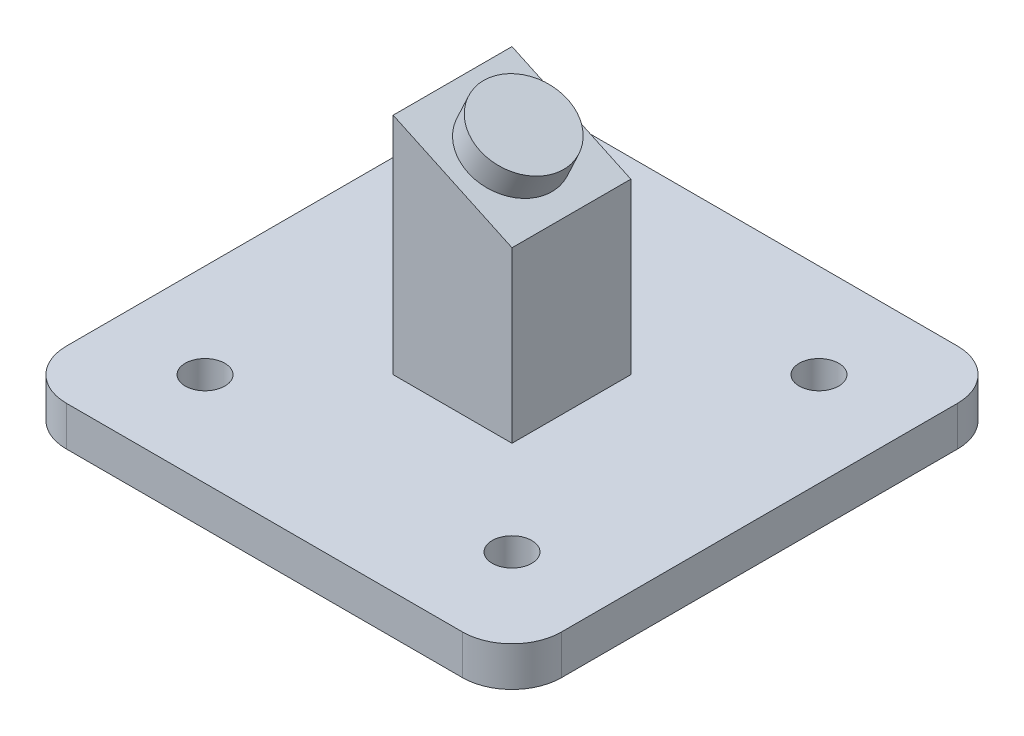
ISO-10303-21;
HEADER;
FILE_DESCRIPTION(('STEP AP214'),'2;1');
FILE_NAME('part.step','',(''),(''),'','','');
FILE_SCHEMA(('AUTOMOTIVE_DESIGN { 1 0 10303 214 1 1 1 1 }'));
ENDSEC;
DATA;
#1=APPLICATION_CONTEXT('core data for automotive mechanical design processes');
#2=APPLICATION_PROTOCOL_DEFINITION('international standard','automotive_design',2000,#1);
#3=PRODUCT_CONTEXT('',#1,'mechanical');
#4=PRODUCT('Part','Part','',(#3));
#5=PRODUCT_RELATED_PRODUCT_CATEGORY('part','',(#4));
#6=PRODUCT_DEFINITION_FORMATION('','',#4);
#7=PRODUCT_DEFINITION_CONTEXT('part definition',#1,'design');
#8=PRODUCT_DEFINITION('design','',#6,#7);
#9=PRODUCT_DEFINITION_SHAPE('','',#8);
#10=(LENGTH_UNIT() NAMED_UNIT(*) SI_UNIT(.MILLI.,.METRE.));
#11=(NAMED_UNIT(*) PLANE_ANGLE_UNIT() SI_UNIT($,.RADIAN.));
#12=(NAMED_UNIT(*) SI_UNIT($,.STERADIAN.) SOLID_ANGLE_UNIT());
#13=UNCERTAINTY_MEASURE_WITH_UNIT(LENGTH_MEASURE(1.E-05),#10,'distance_accuracy_value','');
#14=(GEOMETRIC_REPRESENTATION_CONTEXT(3) GLOBAL_UNCERTAINTY_ASSIGNED_CONTEXT((#13)) GLOBAL_UNIT_ASSIGNED_CONTEXT((#10,
#11,#12)) REPRESENTATION_CONTEXT('',''));
#15=CARTESIAN_POINT('',(0.,0.,0.));
#16=DIRECTION('',(0.,0.,1.));
#17=DIRECTION('',(1.,0.,0.));
#18=AXIS2_PLACEMENT_3D('',#15,#16,#17);
#19=CARTESIAN_POINT('',(45.,4.,-45.));
#20=DIRECTION('',(0.,-1.,0.));
#21=DIRECTION('',(0.,0.,-1.));
#22=AXIS2_PLACEMENT_3D('',#19,#20,#21);
#23=PLANE('',#22);
#24=CARTESIAN_POINT('',(40.5,4.,-9.5));
#25=DIRECTION('',(0.,1.,0.));
#26=DIRECTION('',(0.,0.,1.));
#27=AXIS2_PLACEMENT_3D('',#24,#25,#26);
#28=CIRCLE('',#27,2.);
#29=CARTESIAN_POINT('',(40.5,4.,-7.5));
#30=VERTEX_POINT('',#29);
#31=EDGE_CURVE('E195',#30,#30,#28,.T.);
#32=ORIENTED_EDGE('',*,*,#31,.F.);
#33=EDGE_LOOP('',(#32));
#34=FACE_BOUND('',#33,.T.);
#35=CARTESIAN_POINT('',(40.5,4.,-40.5));
#36=DIRECTION('',(0.,1.,0.));
#37=DIRECTION('',(0.,0.,1.));
#38=AXIS2_PLACEMENT_3D('',#35,#36,#37);
#39=CIRCLE('',#38,2.);
#40=CARTESIAN_POINT('',(40.5,4.,-38.5));
#41=VERTEX_POINT('',#40);
#42=EDGE_CURVE('E203',#41,#41,#39,.T.);
#43=ORIENTED_EDGE('',*,*,#42,.F.);
#44=EDGE_LOOP('',(#43));
#45=FACE_BOUND('',#44,.T.);
#46=CARTESIAN_POINT('',(9.50000000000001,4.,-40.5));
#47=DIRECTION('',(0.,1.,0.));
#48=DIRECTION('',(0.,0.,1.));
#49=AXIS2_PLACEMENT_3D('',#46,#47,#48);
#50=CIRCLE('',#49,2.);
#51=CARTESIAN_POINT('',(9.50000000000001,4.,-38.5));
#52=VERTEX_POINT('',#51);
#53=EDGE_CURVE('E211',#52,#52,#50,.T.);
#54=ORIENTED_EDGE('',*,*,#53,.F.);
#55=EDGE_LOOP('',(#54));
#56=FACE_BOUND('',#55,.T.);
#57=CARTESIAN_POINT('',(9.50000000000001,4.,-9.5));
#58=DIRECTION('',(0.,1.,0.));
#59=DIRECTION('',(0.,0.,1.));
#60=AXIS2_PLACEMENT_3D('',#57,#58,#59);
#61=CIRCLE('',#60,2.);
#62=CARTESIAN_POINT('',(9.50000000000001,4.,-7.5));
#63=VERTEX_POINT('',#62);
#64=EDGE_CURVE('E219',#63,#63,#61,.T.);
#65=ORIENTED_EDGE('',*,*,#64,.F.);
#66=EDGE_LOOP('',(#65));
#67=FACE_BOUND('',#66,.T.);
#68=CARTESIAN_POINT('',(45.,4.,-45.));
#69=DIRECTION('',(0.,1.,0.));
#70=DIRECTION('',(0.,0.,-1.));
#71=AXIS2_PLACEMENT_3D('',#68,#69,#70);
#72=CIRCLE('',#71,5.);
#73=CARTESIAN_POINT('',(50.,4.,-45.));
#74=VERTEX_POINT('',#73);
#75=CARTESIAN_POINT('',(45.,4.,-50.));
#76=VERTEX_POINT('',#75);
#77=EDGE_CURVE('E227',#74,#76,#72,.T.);
#78=ORIENTED_EDGE('',*,*,#77,.T.);
#79=DIRECTION('',(-1.,0.,0.));
#80=VECTOR('',#79,1.);
#81=CARTESIAN_POINT('',(5.00000000000004,4.,-50.));
#82=LINE('',#81,#80);
#83=CARTESIAN_POINT('',(5.00000000000004,4.,-50.));
#84=VERTEX_POINT('',#83);
#85=EDGE_CURVE('E231',#76,#84,#82,.T.);
#86=ORIENTED_EDGE('',*,*,#85,.T.);
#87=CARTESIAN_POINT('',(5.,4.,-45.));
#88=DIRECTION('',(0.,1.,0.));
#89=DIRECTION('',(0.,0.,-1.));
#90=AXIS2_PLACEMENT_3D('',#87,#88,#89);
#91=CIRCLE('',#90,5.);
#92=CARTESIAN_POINT('',(0.,4.,-45.));
#93=VERTEX_POINT('',#92);
#94=EDGE_CURVE('E235',#84,#93,#91,.T.);
#95=ORIENTED_EDGE('',*,*,#94,.T.);
#96=DIRECTION('',(0.,0.,1.));
#97=VECTOR('',#96,1.);
#98=CARTESIAN_POINT('',(0.,4.,-5.00000000000004));
#99=LINE('',#98,#97);
#100=CARTESIAN_POINT('',(0.,4.,-5.00000000000004));
#101=VERTEX_POINT('',#100);
#102=EDGE_CURVE('E238',#93,#101,#99,.T.);
#103=ORIENTED_EDGE('',*,*,#102,.T.);
#104=CARTESIAN_POINT('',(5.,4.,-5.));
#105=DIRECTION('',(0.,1.,0.));
#106=DIRECTION('',(0.,0.,-1.));
#107=AXIS2_PLACEMENT_3D('',#104,#105,#106);
#108=CIRCLE('',#107,5.);
#109=CARTESIAN_POINT('',(5.00000000000004,4.,0.));
#110=VERTEX_POINT('',#109);
#111=EDGE_CURVE('E241',#101,#110,#108,.T.);
#112=ORIENTED_EDGE('',*,*,#111,.T.);
#113=DIRECTION('',(1.,0.,0.));
#114=VECTOR('',#113,1.);
#115=CARTESIAN_POINT('',(5.00000000000004,4.,0.));
#116=LINE('',#115,#114);
#117=CARTESIAN_POINT('',(45.,4.,0.));
#118=VERTEX_POINT('',#117);
#119=EDGE_CURVE('E243',#110,#118,#116,.T.);
#120=ORIENTED_EDGE('',*,*,#119,.T.);
#121=CARTESIAN_POINT('',(45.,4.,-5.));
#122=DIRECTION('',(0.,1.,0.));
#123=DIRECTION('',(0.,0.,1.));
#124=AXIS2_PLACEMENT_3D('',#121,#122,#123);
#125=CIRCLE('',#124,5.);
#126=CARTESIAN_POINT('',(50.,4.,-5.00000000000003));
#127=VERTEX_POINT('',#126);
#128=EDGE_CURVE('E246',#118,#127,#125,.T.);
#129=ORIENTED_EDGE('',*,*,#128,.T.);
#130=DIRECTION('',(0.,0.,-1.));
#131=VECTOR('',#130,1.);
#132=CARTESIAN_POINT('',(50.,4.,-5.00000000000004));
#133=LINE('',#132,#131);
#134=EDGE_CURVE('E249',#127,#74,#133,.T.);
#135=ORIENTED_EDGE('',*,*,#134,.T.);
#136=EDGE_LOOP('',(#78,#86,#95,#103,#112,#120,#129,#135));
#137=FACE_BOUND('',#136,.T.);
#138=DIRECTION('',(0.,0.,1.));
#139=VECTOR('',#138,1.);
#140=CARTESIAN_POINT('',(19.,4.,-31.));
#141=LINE('',#140,#139);
#142=CARTESIAN_POINT('',(19.,4.,-31.));
#143=VERTEX_POINT('',#142);
#144=CARTESIAN_POINT('',(19.,4.,-19.));
#145=VERTEX_POINT('',#144);
#146=EDGE_CURVE('E142',#143,#145,#141,.T.);
#147=ORIENTED_EDGE('',*,*,#146,.F.);
#148=DIRECTION('',(-1.,0.,0.));
#149=VECTOR('',#148,1.);
#150=CARTESIAN_POINT('',(19.,4.,-31.));
#151=LINE('',#150,#149);
#152=CARTESIAN_POINT('',(31.,4.,-31.));
#153=VERTEX_POINT('',#152);
#154=EDGE_CURVE('E177',#153,#143,#151,.T.);
#155=ORIENTED_EDGE('',*,*,#154,.F.);
#156=DIRECTION('',(0.,0.,-1.));
#157=VECTOR('',#156,1.);
#158=CARTESIAN_POINT('',(31.,4.,-31.));
#159=LINE('',#158,#157);
#160=CARTESIAN_POINT('',(31.,4.,-19.));
#161=VERTEX_POINT('',#160);
#162=EDGE_CURVE('E69',#161,#153,#159,.T.);
#163=ORIENTED_EDGE('',*,*,#162,.F.);
#164=DIRECTION('',(1.,0.,0.));
#165=VECTOR('',#164,1.);
#166=CARTESIAN_POINT('',(19.,4.,-19.));
#167=LINE('',#166,#165);
#168=EDGE_CURVE('E64',#145,#161,#167,.T.);
#169=ORIENTED_EDGE('',*,*,#168,.F.);
#170=EDGE_LOOP('',(#147,#155,#163,#169));
#171=FACE_BOUND('',#170,.T.);
#172=ADVANCED_FACE('F47',(#34,#45,#56,#67,#137,#171),#23,.F.);
#173=CARTESIAN_POINT('',(45.,0.,-45.));
#174=DIRECTION('',(0.,-1.,0.));
#175=DIRECTION('',(0.,0.,-1.));
#176=AXIS2_PLACEMENT_3D('',#173,#174,#175);
#177=PLANE('',#176);
#178=CARTESIAN_POINT('',(40.5,0.,-40.5));
#179=DIRECTION('',(0.,1.,0.));
#180=DIRECTION('',(0.,0.,1.));
#181=AXIS2_PLACEMENT_3D('',#178,#179,#180);
#182=CIRCLE('',#181,2.);
#183=CARTESIAN_POINT('',(40.5,0.,-38.5));
#184=VERTEX_POINT('',#183);
#185=EDGE_CURVE('E199',#184,#184,#182,.T.);
#186=ORIENTED_EDGE('',*,*,#185,.T.);
#187=EDGE_LOOP('',(#186));
#188=FACE_BOUND('',#187,.T.);
#189=CARTESIAN_POINT('',(9.50000000000001,0.,-9.5));
#190=DIRECTION('',(0.,1.,0.));
#191=DIRECTION('',(0.,0.,1.));
#192=AXIS2_PLACEMENT_3D('',#189,#190,#191);
#193=CIRCLE('',#192,2.);
#194=CARTESIAN_POINT('',(9.50000000000001,0.,-7.5));
#195=VERTEX_POINT('',#194);
#196=EDGE_CURVE('E215',#195,#195,#193,.T.);
#197=ORIENTED_EDGE('',*,*,#196,.T.);
#198=EDGE_LOOP('',(#197));
#199=FACE_BOUND('',#198,.T.);
#200=CARTESIAN_POINT('',(45.,0.,-45.));
#201=DIRECTION('',(0.,1.,0.));
#202=DIRECTION('',(0.,0.,-1.));
#203=AXIS2_PLACEMENT_3D('',#200,#201,#202);
#204=CIRCLE('',#203,5.);
#205=CARTESIAN_POINT('',(50.,0.,-45.));
#206=VERTEX_POINT('',#205);
#207=CARTESIAN_POINT('',(45.,0.,-50.));
#208=VERTEX_POINT('',#207);
#209=EDGE_CURVE('E223',#206,#208,#204,.T.);
#210=ORIENTED_EDGE('',*,*,#209,.F.);
#211=DIRECTION('',(0.,0.,-1.));
#212=VECTOR('',#211,1.);
#213=CARTESIAN_POINT('',(50.,0.,-5.00000000000004));
#214=LINE('',#213,#212);
#215=CARTESIAN_POINT('',(50.,0.,-5.00000000000003));
#216=VERTEX_POINT('',#215);
#217=EDGE_CURVE('E232',#216,#206,#214,.T.);
#218=ORIENTED_EDGE('',*,*,#217,.F.);
#219=CARTESIAN_POINT('',(45.,0.,-5.));
#220=DIRECTION('',(0.,1.,0.));
#221=DIRECTION('',(0.,0.,1.));
#222=AXIS2_PLACEMENT_3D('',#219,#220,#221);
#223=CIRCLE('',#222,5.);
#224=CARTESIAN_POINT('',(45.,0.,0.));
#225=VERTEX_POINT('',#224);
#226=EDGE_CURVE('E271',#225,#216,#223,.T.);
#227=ORIENTED_EDGE('',*,*,#226,.F.);
#228=DIRECTION('',(1.,0.,0.));
#229=VECTOR('',#228,1.);
#230=CARTESIAN_POINT('',(5.00000000000004,0.,0.));
#231=LINE('',#230,#229);
#232=CARTESIAN_POINT('',(5.00000000000004,0.,0.));
#233=VERTEX_POINT('',#232);
#234=EDGE_CURVE('E268',#233,#225,#231,.T.);
#235=ORIENTED_EDGE('',*,*,#234,.F.);
#236=CARTESIAN_POINT('',(5.,0.,-5.));
#237=DIRECTION('',(0.,1.,0.));
#238=DIRECTION('',(0.,0.,-1.));
#239=AXIS2_PLACEMENT_3D('',#236,#237,#238);
#240=CIRCLE('',#239,5.);
#241=CARTESIAN_POINT('',(0.,0.,-5.00000000000004));
#242=VERTEX_POINT('',#241);
#243=EDGE_CURVE('E265',#242,#233,#240,.T.);
#244=ORIENTED_EDGE('',*,*,#243,.F.);
#245=DIRECTION('',(0.,0.,1.));
#246=VECTOR('',#245,1.);
#247=CARTESIAN_POINT('',(0.,0.,-5.00000000000004));
#248=LINE('',#247,#246);
#249=CARTESIAN_POINT('',(0.,0.,-45.));
#250=VERTEX_POINT('',#249);
#251=EDGE_CURVE('E262',#250,#242,#248,.T.);
#252=ORIENTED_EDGE('',*,*,#251,.F.);
#253=CARTESIAN_POINT('',(5.,0.,-45.));
#254=DIRECTION('',(0.,1.,0.));
#255=DIRECTION('',(0.,0.,-1.));
#256=AXIS2_PLACEMENT_3D('',#253,#254,#255);
#257=CIRCLE('',#256,5.);
#258=CARTESIAN_POINT('',(5.00000000000004,0.,-50.));
#259=VERTEX_POINT('',#258);
#260=EDGE_CURVE('E259',#259,#250,#257,.T.);
#261=ORIENTED_EDGE('',*,*,#260,.F.);
#262=DIRECTION('',(-1.,0.,0.));
#263=VECTOR('',#262,1.);
#264=CARTESIAN_POINT('',(5.00000000000004,0.,-50.));
#265=LINE('',#264,#263);
#266=EDGE_CURVE('E256',#208,#259,#265,.T.);
#267=ORIENTED_EDGE('',*,*,#266,.F.);
#268=EDGE_LOOP('',(#210,#218,#227,#235,#244,#252,#261,#267));
#269=FACE_BOUND('',#268,.T.);
#270=CARTESIAN_POINT('',(9.50000000000001,0.,-40.5));
#271=DIRECTION('',(0.,1.,0.));
#272=DIRECTION('',(0.,0.,1.));
#273=AXIS2_PLACEMENT_3D('',#270,#271,#272);
#274=CIRCLE('',#273,2.);
#275=CARTESIAN_POINT('',(9.50000000000001,0.,-38.5));
#276=VERTEX_POINT('',#275);
#277=EDGE_CURVE('E207',#276,#276,#274,.T.);
#278=ORIENTED_EDGE('',*,*,#277,.T.);
#279=EDGE_LOOP('',(#278));
#280=FACE_BOUND('',#279,.T.);
#281=CARTESIAN_POINT('',(40.5,0.,-9.5));
#282=DIRECTION('',(0.,1.,0.));
#283=DIRECTION('',(0.,0.,1.));
#284=AXIS2_PLACEMENT_3D('',#281,#282,#283);
#285=CIRCLE('',#284,2.);
#286=CARTESIAN_POINT('',(40.5,0.,-7.5));
#287=VERTEX_POINT('',#286);
#288=EDGE_CURVE('E146',#287,#287,#285,.T.);
#289=ORIENTED_EDGE('',*,*,#288,.T.);
#290=EDGE_LOOP('',(#289));
#291=FACE_BOUND('',#290,.T.);
#292=ADVANCED_FACE('F317',(#188,#199,#269,#280,#291),#177,.T.);
#293=CARTESIAN_POINT('',(45.,4.,-45.));
#294=DIRECTION('',(0.,-1.,0.));
#295=DIRECTION('',(0.,0.,-1.));
#296=AXIS2_PLACEMENT_3D('',#293,#294,#295);
#297=CYLINDRICAL_SURFACE('',#296,5.);
#298=ORIENTED_EDGE('',*,*,#209,.T.);
#299=DIRECTION('',(0.,-1.,0.));
#300=VECTOR('',#299,1.);
#301=CARTESIAN_POINT('',(45.,4.,-50.));
#302=LINE('',#301,#300);
#303=EDGE_CURVE('E51',#76,#208,#302,.T.);
#304=ORIENTED_EDGE('',*,*,#303,.F.);
#305=ORIENTED_EDGE('',*,*,#77,.F.);
#306=DIRECTION('',(0.,-1.,0.));
#307=VECTOR('',#306,1.);
#308=CARTESIAN_POINT('',(50.,4.,-45.));
#309=LINE('',#308,#307);
#310=EDGE_CURVE('E252',#74,#206,#309,.T.);
#311=ORIENTED_EDGE('',*,*,#310,.T.);
#312=EDGE_LOOP('',(#298,#304,#305,#311));
#313=FACE_BOUND('',#312,.T.);
#314=ADVANCED_FACE('F49',(#313),#297,.T.);
#315=CARTESIAN_POINT('',(5.00000000000004,4.,-50.));
#316=DIRECTION('',(0.,0.,1.));
#317=DIRECTION('',(1.,0.,0.));
#318=AXIS2_PLACEMENT_3D('',#315,#316,#317);
#319=PLANE('',#318);
#320=ORIENTED_EDGE('',*,*,#266,.T.);
#321=DIRECTION('',(0.,-1.,0.));
#322=VECTOR('',#321,1.);
#323=CARTESIAN_POINT('',(5.00000000000004,4.,-50.));
#324=LINE('',#323,#322);
#325=EDGE_CURVE('E297',#84,#259,#324,.T.);
#326=ORIENTED_EDGE('',*,*,#325,.F.);
#327=ORIENTED_EDGE('',*,*,#85,.F.);
#328=ORIENTED_EDGE('',*,*,#303,.T.);
#329=EDGE_LOOP('',(#320,#326,#327,#328));
#330=FACE_BOUND('',#329,.T.);
#331=ADVANCED_FACE('F310',(#330),#319,.F.);
#332=CARTESIAN_POINT('',(5.,4.,-45.));
#333=DIRECTION('',(0.,-1.,0.));
#334=DIRECTION('',(0.,0.,-1.));
#335=AXIS2_PLACEMENT_3D('',#332,#333,#334);
#336=CYLINDRICAL_SURFACE('',#335,5.);
#337=ORIENTED_EDGE('',*,*,#260,.T.);
#338=DIRECTION('',(0.,-1.,0.));
#339=VECTOR('',#338,1.);
#340=CARTESIAN_POINT('',(0.,4.,-45.));
#341=LINE('',#340,#339);
#342=EDGE_CURVE('E295',#93,#250,#341,.T.);
#343=ORIENTED_EDGE('',*,*,#342,.F.);
#344=ORIENTED_EDGE('',*,*,#94,.F.);
#345=ORIENTED_EDGE('',*,*,#325,.T.);
#346=EDGE_LOOP('',(#337,#343,#344,#345));
#347=FACE_BOUND('',#346,.T.);
#348=ADVANCED_FACE('F323',(#347),#336,.T.);
#349=CARTESIAN_POINT('',(0.,4.,-5.00000000000004));
#350=DIRECTION('',(1.,0.,0.));
#351=DIRECTION('',(0.,0.,-1.));
#352=AXIS2_PLACEMENT_3D('',#349,#350,#351);
#353=PLANE('',#352);
#354=ORIENTED_EDGE('',*,*,#251,.T.);
#355=DIRECTION('',(0.,-1.,0.));
#356=VECTOR('',#355,1.);
#357=CARTESIAN_POINT('',(0.,4.,-5.00000000000004));
#358=LINE('',#357,#356);
#359=EDGE_CURVE('E291',#101,#242,#358,.T.);
#360=ORIENTED_EDGE('',*,*,#359,.F.);
#361=ORIENTED_EDGE('',*,*,#102,.F.);
#362=ORIENTED_EDGE('',*,*,#342,.T.);
#363=EDGE_LOOP('',(#354,#360,#361,#362));
#364=FACE_BOUND('',#363,.T.);
#365=ADVANCED_FACE('F326',(#364),#353,.F.);
#366=CARTESIAN_POINT('',(5.,4.,-5.));
#367=DIRECTION('',(0.,-1.,0.));
#368=DIRECTION('',(0.,0.,-1.));
#369=AXIS2_PLACEMENT_3D('',#366,#367,#368);
#370=CYLINDRICAL_SURFACE('',#369,5.);
#371=ORIENTED_EDGE('',*,*,#243,.T.);
#372=DIRECTION('',(0.,-1.,0.));
#373=VECTOR('',#372,1.);
#374=CARTESIAN_POINT('',(5.00000000000004,4.,0.));
#375=LINE('',#374,#373);
#376=EDGE_CURVE('E287',#110,#233,#375,.T.);
#377=ORIENTED_EDGE('',*,*,#376,.F.);
#378=ORIENTED_EDGE('',*,*,#111,.F.);
#379=ORIENTED_EDGE('',*,*,#359,.T.);
#380=EDGE_LOOP('',(#371,#377,#378,#379));
#381=FACE_BOUND('',#380,.T.);
#382=ADVANCED_FACE('F344',(#381),#370,.T.);
#383=CARTESIAN_POINT('',(5.00000000000004,4.,0.));
#384=DIRECTION('',(0.,0.,-1.));
#385=DIRECTION('',(-1.,0.,0.));
#386=AXIS2_PLACEMENT_3D('',#383,#384,#385);
#387=PLANE('',#386);
#388=ORIENTED_EDGE('',*,*,#234,.T.);
#389=DIRECTION('',(0.,-1.,0.));
#390=VECTOR('',#389,1.);
#391=CARTESIAN_POINT('',(45.,4.,0.));
#392=LINE('',#391,#390);
#393=EDGE_CURVE('E283',#118,#225,#392,.T.);
#394=ORIENTED_EDGE('',*,*,#393,.F.);
#395=ORIENTED_EDGE('',*,*,#119,.F.);
#396=ORIENTED_EDGE('',*,*,#376,.T.);
#397=EDGE_LOOP('',(#388,#394,#395,#396));
#398=FACE_BOUND('',#397,.T.);
#399=ADVANCED_FACE('F341',(#398),#387,.F.);
#400=CARTESIAN_POINT('',(45.,4.,-5.));
#401=DIRECTION('',(0.,-1.,0.));
#402=DIRECTION('',(0.,0.,-1.));
#403=AXIS2_PLACEMENT_3D('',#400,#401,#402);
#404=CYLINDRICAL_SURFACE('',#403,5.);
#405=ORIENTED_EDGE('',*,*,#226,.T.);
#406=DIRECTION('',(0.,-1.,0.));
#407=VECTOR('',#406,1.);
#408=CARTESIAN_POINT('',(50.,4.,-5.00000000000003));
#409=LINE('',#408,#407);
#410=EDGE_CURVE('E279',#127,#216,#409,.T.);
#411=ORIENTED_EDGE('',*,*,#410,.F.);
#412=ORIENTED_EDGE('',*,*,#128,.F.);
#413=ORIENTED_EDGE('',*,*,#393,.T.);
#414=EDGE_LOOP('',(#405,#411,#412,#413));
#415=FACE_BOUND('',#414,.T.);
#416=ADVANCED_FACE('F337',(#415),#404,.T.);
#417=CARTESIAN_POINT('',(50.,4.,-5.00000000000004));
#418=DIRECTION('',(-1.,0.,0.));
#419=DIRECTION('',(0.,0.,1.));
#420=AXIS2_PLACEMENT_3D('',#417,#418,#419);
#421=PLANE('',#420);
#422=ORIENTED_EDGE('',*,*,#217,.T.);
#423=ORIENTED_EDGE('',*,*,#310,.F.);
#424=ORIENTED_EDGE('',*,*,#134,.F.);
#425=ORIENTED_EDGE('',*,*,#410,.T.);
#426=EDGE_LOOP('',(#422,#423,#424,#425));
#427=FACE_BOUND('',#426,.T.);
#428=ADVANCED_FACE('F335',(#427),#421,.F.);
#429=CARTESIAN_POINT('',(9.50000000000001,4.,-9.5));
#430=DIRECTION('',(0.,-1.,0.));
#431=DIRECTION('',(0.,0.,-1.));
#432=AXIS2_PLACEMENT_3D('',#429,#430,#431);
#433=CYLINDRICAL_SURFACE('',#432,2.);
#434=ORIENTED_EDGE('',*,*,#64,.T.);
#435=EDGE_LOOP('',(#434));
#436=FACE_BOUND('',#435,.T.);
#437=ORIENTED_EDGE('',*,*,#196,.F.);
#438=EDGE_LOOP('',(#437));
#439=FACE_BOUND('',#438,.T.);
#440=ADVANCED_FACE('F364',(#436,#439),#433,.F.);
#441=CARTESIAN_POINT('',(9.50000000000001,4.,-40.5));
#442=DIRECTION('',(0.,-1.,0.));
#443=DIRECTION('',(0.,0.,-1.));
#444=AXIS2_PLACEMENT_3D('',#441,#442,#443);
#445=CYLINDRICAL_SURFACE('',#444,2.);
#446=ORIENTED_EDGE('',*,*,#53,.T.);
#447=EDGE_LOOP('',(#446));
#448=FACE_BOUND('',#447,.T.);
#449=ORIENTED_EDGE('',*,*,#277,.F.);
#450=EDGE_LOOP('',(#449));
#451=FACE_BOUND('',#450,.T.);
#452=ADVANCED_FACE('F382',(#448,#451),#445,.F.);
#453=CARTESIAN_POINT('',(40.5,4.,-40.5));
#454=DIRECTION('',(0.,-1.,0.));
#455=DIRECTION('',(0.,0.,-1.));
#456=AXIS2_PLACEMENT_3D('',#453,#454,#455);
#457=CYLINDRICAL_SURFACE('',#456,2.);
#458=ORIENTED_EDGE('',*,*,#42,.T.);
#459=EDGE_LOOP('',(#458));
#460=FACE_BOUND('',#459,.T.);
#461=ORIENTED_EDGE('',*,*,#185,.F.);
#462=EDGE_LOOP('',(#461));
#463=FACE_BOUND('',#462,.T.);
#464=ADVANCED_FACE('F388',(#460,#463),#457,.F.);
#465=CARTESIAN_POINT('',(40.5,4.,-9.5));
#466=DIRECTION('',(0.,-1.,0.));
#467=DIRECTION('',(0.,0.,-1.));
#468=AXIS2_PLACEMENT_3D('',#465,#466,#467);
#469=CYLINDRICAL_SURFACE('',#468,2.);
#470=ORIENTED_EDGE('',*,*,#31,.T.);
#471=EDGE_LOOP('',(#470));
#472=FACE_BOUND('',#471,.T.);
#473=ORIENTED_EDGE('',*,*,#288,.F.);
#474=EDGE_LOOP('',(#473));
#475=FACE_BOUND('',#474,.T.);
#476=ADVANCED_FACE('F394',(#472,#475),#469,.F.);
#477=CARTESIAN_POINT('',(19.,21.1,-31.));
#478=DIRECTION('',(1.,0.,0.));
#479=DIRECTION('',(0.,0.,-1.));
#480=AXIS2_PLACEMENT_3D('',#477,#478,#479);
#481=PLANE('',#480);
#482=ORIENTED_EDGE('',*,*,#146,.T.);
#483=DIRECTION('',(0.,-1.,0.));
#484=VECTOR('',#483,1.);
#485=CARTESIAN_POINT('',(19.,21.1,-19.));
#486=LINE('',#485,#484);
#487=CARTESIAN_POINT('',(19.,26.6956918978599,-19.));
#488=VERTEX_POINT('',#487);
#489=EDGE_CURVE('E136',#488,#145,#486,.T.);
#490=ORIENTED_EDGE('',*,*,#489,.F.);
#491=DIRECTION('',(0.,0.,1.));
#492=VECTOR('',#491,1.);
#493=CARTESIAN_POINT('',(19.,26.6956918978599,-44.2405350275499));
#494=LINE('',#493,#492);
#495=CARTESIAN_POINT('',(19.,26.6956918978599,-31.));
#496=VERTEX_POINT('',#495);
#497=EDGE_CURVE('E140',#496,#488,#494,.T.);
#498=ORIENTED_EDGE('',*,*,#497,.F.);
#499=DIRECTION('',(0.,-1.,0.));
#500=VECTOR('',#499,1.);
#501=CARTESIAN_POINT('',(19.,21.1,-31.));
#502=LINE('',#501,#500);
#503=EDGE_CURVE('E176',#496,#143,#502,.T.);
#504=ORIENTED_EDGE('',*,*,#503,.T.);
#505=EDGE_LOOP('',(#482,#490,#498,#504));
#506=FACE_BOUND('',#505,.T.);
#507=ADVANCED_FACE('F138',(#506),#481,.F.);
#508=CARTESIAN_POINT('',(19.,21.1,-19.));
#509=DIRECTION('',(0.,0.,-1.));
#510=DIRECTION('',(-1.,0.,0.));
#511=AXIS2_PLACEMENT_3D('',#508,#509,#510);
#512=PLANE('',#511);
#513=ORIENTED_EDGE('',*,*,#168,.T.);
#514=DIRECTION('',(0.,-1.,0.));
#515=VECTOR('',#514,1.);
#516=CARTESIAN_POINT('',(31.,21.1,-19.));
#517=LINE('',#516,#515);
#518=CARTESIAN_POINT('',(31.,21.1,-19.));
#519=VERTEX_POINT('',#518);
#520=EDGE_CURVE('E147',#519,#161,#517,.T.);
#521=ORIENTED_EDGE('',*,*,#520,.F.);
#522=DIRECTION('',(-0.906307787036652,0.422618261740694,0.));
#523=VECTOR('',#522,1.);
#524=CARTESIAN_POINT('',(31.,21.1,-19.));
#525=LINE('',#524,#523);
#526=EDGE_CURVE('E153',#519,#488,#525,.T.);
#527=ORIENTED_EDGE('',*,*,#526,.T.);
#528=ORIENTED_EDGE('',*,*,#489,.T.);
#529=EDGE_LOOP('',(#513,#521,#527,#528));
#530=FACE_BOUND('',#529,.T.);
#531=ADVANCED_FACE('F158',(#530),#512,.F.);
#532=CARTESIAN_POINT('',(31.,21.1,-31.));
#533=DIRECTION('',(-1.,0.,0.));
#534=DIRECTION('',(0.,0.,1.));
#535=AXIS2_PLACEMENT_3D('',#532,#533,#534);
#536=PLANE('',#535);
#537=ORIENTED_EDGE('',*,*,#162,.T.);
#538=DIRECTION('',(0.,-1.,0.));
#539=VECTOR('',#538,1.);
#540=CARTESIAN_POINT('',(31.,21.1,-31.));
#541=LINE('',#540,#539);
#542=CARTESIAN_POINT('',(31.,21.1,-31.));
#543=VERTEX_POINT('',#542);
#544=EDGE_CURVE('E189',#543,#153,#541,.T.);
#545=ORIENTED_EDGE('',*,*,#544,.F.);
#546=DIRECTION('',(0.,0.,-1.));
#547=VECTOR('',#546,1.);
#548=CARTESIAN_POINT('',(31.,21.1,-31.));
#549=LINE('',#548,#547);
#550=EDGE_CURVE('E173',#519,#543,#549,.T.);
#551=ORIENTED_EDGE('',*,*,#550,.F.);
#552=ORIENTED_EDGE('',*,*,#520,.T.);
#553=EDGE_LOOP('',(#537,#545,#551,#552));
#554=FACE_BOUND('',#553,.T.);
#555=ADVANCED_FACE('F412',(#554),#536,.F.);
#556=CARTESIAN_POINT('',(19.,21.1,-31.));
#557=DIRECTION('',(0.,0.,1.));
#558=DIRECTION('',(1.,0.,0.));
#559=AXIS2_PLACEMENT_3D('',#556,#557,#558);
#560=PLANE('',#559);
#561=ORIENTED_EDGE('',*,*,#154,.T.);
#562=ORIENTED_EDGE('',*,*,#503,.F.);
#563=DIRECTION('',(0.906307787036653,-0.422618261740694,0.));
#564=VECTOR('',#563,1.);
#565=CARTESIAN_POINT('',(31.,21.1,-31.));
#566=LINE('',#565,#564);
#567=EDGE_CURVE('E155',#496,#543,#566,.T.);
#568=ORIENTED_EDGE('',*,*,#567,.T.);
#569=ORIENTED_EDGE('',*,*,#544,.T.);
#570=EDGE_LOOP('',(#561,#562,#568,#569));
#571=FACE_BOUND('',#570,.T.);
#572=ADVANCED_FACE('F418',(#571),#560,.F.);
#573=CARTESIAN_POINT('',(31.,21.1,-44.2405350275499));
#574=DIRECTION('',(0.422618261740694,0.906307787036653,0.));
#575=DIRECTION('',(-0.906307787036653,0.422618261740694,0.));
#576=AXIS2_PLACEMENT_3D('',#573,#574,#575);
#577=PLANE('',#576);
#578=CARTESIAN_POINT('',(25.,23.89784594893,-25.));
#579=DIRECTION('',(0.422618261740694,0.906307787036653,0.));
#580=DIRECTION('',(-0.906307787036653,0.422618261740694,0.));
#581=AXIS2_PLACEMENT_3D('',#578,#579,#580);
#582=CIRCLE('',#581,4.45000000000001);
#583=CARTESIAN_POINT('',(20.9669303476869,25.778497213676,-25.));
#584=VERTEX_POINT('',#583);
#585=EDGE_CURVE('E11',#584,#584,#582,.T.);
#586=ORIENTED_EDGE('',*,*,#585,.F.);
#587=EDGE_LOOP('',(#586));
#588=FACE_BOUND('',#587,.T.);
#589=ORIENTED_EDGE('',*,*,#567,.F.);
#590=ORIENTED_EDGE('',*,*,#497,.T.);
#591=ORIENTED_EDGE('',*,*,#526,.F.);
#592=ORIENTED_EDGE('',*,*,#550,.T.);
#593=EDGE_LOOP('',(#589,#590,#591,#592));
#594=FACE_BOUND('',#593,.T.);
#595=ADVANCED_FACE('F151',(#588,#594),#577,.T.);
#596=CARTESIAN_POINT('',(26.183331132874,26.4355077526326,-25.));
#597=DIRECTION('',(-0.422618261740694,-0.906307787036653,0.));
#598=DIRECTION('',(0.906307787036653,-0.422618261740694,0.));
#599=AXIS2_PLACEMENT_3D('',#596,#597,#598);
#600=CYLINDRICAL_SURFACE('',#599,4.45000000000001);
#601=CARTESIAN_POINT('',(26.183331132874,26.4355077526326,-25.));
#602=DIRECTION('',(0.422618261740694,0.906307787036653,0.));
#603=DIRECTION('',(-0.906307787036653,0.422618261740694,0.));
#604=AXIS2_PLACEMENT_3D('',#601,#602,#603);
#605=CIRCLE('',#604,4.45000000000001);
#606=CARTESIAN_POINT('',(22.1502614805608,28.3161590173787,-25.));
#607=VERTEX_POINT('',#606);
#608=EDGE_CURVE('E162',#607,#607,#605,.T.);
#609=ORIENTED_EDGE('',*,*,#608,.F.);
#610=EDGE_LOOP('',(#609));
#611=FACE_BOUND('',#610,.T.);
#612=ORIENTED_EDGE('',*,*,#585,.T.);
#613=EDGE_LOOP('',(#612));
#614=FACE_BOUND('',#613,.T.);
#615=ADVANCED_FACE('F431',(#611,#614),#600,.T.);
#616=CARTESIAN_POINT('',(26.183331132874,26.4355077526326,-25.));
#617=DIRECTION('',(0.422618261740694,0.906307787036653,0.));
#618=DIRECTION('',(-0.906307787036653,0.422618261740694,0.));
#619=AXIS2_PLACEMENT_3D('',#616,#617,#618);
#620=PLANE('',#619);
#621=ORIENTED_EDGE('',*,*,#608,.T.);
#622=EDGE_LOOP('',(#621));
#623=FACE_BOUND('',#622,.T.);
#624=ADVANCED_FACE('F438',(#623),#620,.T.);
#625=CLOSED_SHELL('',(#172,#292,#314,#331,#348,#365,#382,#399,#416,#428,#440,#452,#464,#476,
#507,#531,#555,#572,#595,#615,#624));
#626=MANIFOLD_SOLID_BREP('B2',#625);
#627=ADVANCED_BREP_SHAPE_REPRESENTATION('',(#18,#626),#14);
#628=SHAPE_DEFINITION_REPRESENTATION(#9,#627);
ENDSEC;
END-ISO-10303-21;
